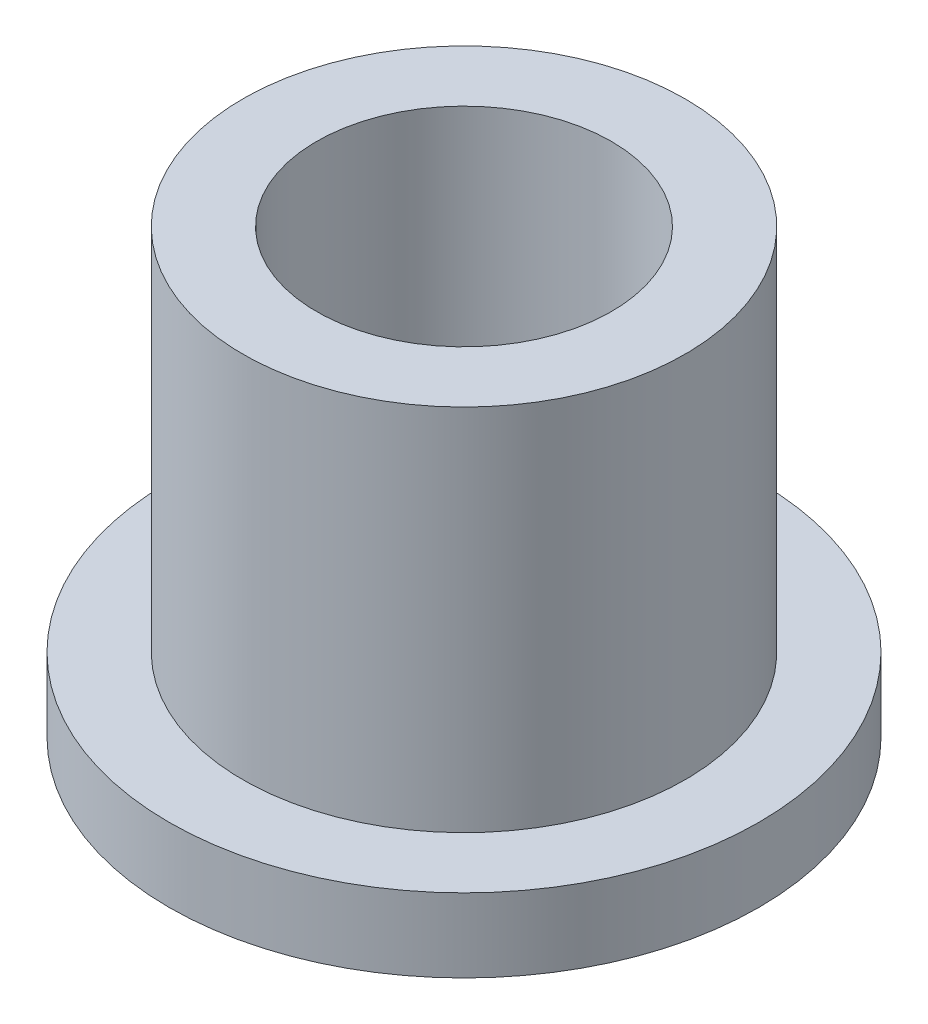
ISO-10303-21;
HEADER;
FILE_DESCRIPTION(('STEP AP214'),'2;1');
FILE_NAME('part.step','',(''),(''),'','','');
FILE_SCHEMA(('AUTOMOTIVE_DESIGN { 1 0 10303 214 1 1 1 1 }'));
ENDSEC;
DATA;
#1=APPLICATION_CONTEXT('core data for automotive mechanical design processes');
#2=APPLICATION_PROTOCOL_DEFINITION('international standard','automotive_design',2000,#1);
#3=PRODUCT_CONTEXT('',#1,'mechanical');
#4=PRODUCT('Part','Part','',(#3));
#5=PRODUCT_RELATED_PRODUCT_CATEGORY('part','',(#4));
#6=PRODUCT_DEFINITION_FORMATION('','',#4);
#7=PRODUCT_DEFINITION_CONTEXT('part definition',#1,'design');
#8=PRODUCT_DEFINITION('design','',#6,#7);
#9=PRODUCT_DEFINITION_SHAPE('','',#8);
#10=(LENGTH_UNIT() NAMED_UNIT(*) SI_UNIT(.MILLI.,.METRE.));
#11=(NAMED_UNIT(*) PLANE_ANGLE_UNIT() SI_UNIT($,.RADIAN.));
#12=(NAMED_UNIT(*) SI_UNIT($,.STERADIAN.) SOLID_ANGLE_UNIT());
#13=UNCERTAINTY_MEASURE_WITH_UNIT(LENGTH_MEASURE(1.E-05),#10,'distance_accuracy_value','');
#14=(GEOMETRIC_REPRESENTATION_CONTEXT(3) GLOBAL_UNCERTAINTY_ASSIGNED_CONTEXT((#13)) GLOBAL_UNIT_ASSIGNED_CONTEXT((#10,
#11,#12)) REPRESENTATION_CONTEXT('',''));
#15=CARTESIAN_POINT('',(0.,0.,0.));
#16=DIRECTION('',(0.,0.,1.));
#17=DIRECTION('',(1.,0.,0.));
#18=AXIS2_PLACEMENT_3D('',#15,#16,#17);
#19=CARTESIAN_POINT('',(0.,9.525,0.));
#20=DIRECTION('',(0.,1.,0.));
#21=DIRECTION('',(0.,0.,1.));
#22=AXIS2_PLACEMENT_3D('',#19,#20,#21);
#23=PLANE('',#22);
#24=CARTESIAN_POINT('',(0.,9.525,0.));
#25=DIRECTION('',(0.,1.,0.));
#26=DIRECTION('',(0.,0.,1.));
#27=AXIS2_PLACEMENT_3D('',#24,#25,#26);
#28=CIRCLE('',#27,4.7625);
#29=CARTESIAN_POINT('',(0.,9.525,-4.7625));
#30=VERTEX_POINT('',#29);
#31=EDGE_CURVE('E10',#30,#30,#28,.T.);
#32=ORIENTED_EDGE('',*,*,#31,.T.);
#33=EDGE_LOOP('',(#32));
#34=FACE_BOUND('',#33,.T.);
#35=CARTESIAN_POINT('',(0.,9.525,0.));
#36=DIRECTION('',(0.,1.,0.));
#37=DIRECTION('',(0.,0.,1.));
#38=AXIS2_PLACEMENT_3D('',#35,#36,#37);
#39=CIRCLE('',#38,3.175);
#40=CARTESIAN_POINT('',(0.,9.525,-3.175));
#41=VERTEX_POINT('',#40);
#42=EDGE_CURVE('E42',#41,#41,#39,.T.);
#43=ORIENTED_EDGE('',*,*,#42,.F.);
#44=EDGE_LOOP('',(#43));
#45=FACE_BOUND('',#44,.T.);
#46=ADVANCED_FACE('F35',(#34,#45),#23,.T.);
#47=CARTESIAN_POINT('',(0.,0.,0.));
#48=DIRECTION('',(0.,1.,0.));
#49=DIRECTION('',(0.,0.,1.));
#50=AXIS2_PLACEMENT_3D('',#47,#48,#49);
#51=PLANE('',#50);
#52=CARTESIAN_POINT('',(0.,0.,0.));
#53=DIRECTION('',(0.,1.,0.));
#54=DIRECTION('',(0.,0.,1.));
#55=AXIS2_PLACEMENT_3D('',#52,#53,#54);
#56=CIRCLE('',#55,3.175);
#57=CARTESIAN_POINT('',(0.,0.,-3.175));
#58=VERTEX_POINT('',#57);
#59=EDGE_CURVE('E46',#58,#58,#56,.T.);
#60=ORIENTED_EDGE('',*,*,#59,.T.);
#61=EDGE_LOOP('',(#60));
#62=FACE_BOUND('',#61,.T.);
#63=CARTESIAN_POINT('',(0.,0.,0.));
#64=DIRECTION('',(0.,1.,0.));
#65=DIRECTION('',(0.,0.,1.));
#66=AXIS2_PLACEMENT_3D('',#63,#64,#65);
#67=CIRCLE('',#66,6.35);
#68=CARTESIAN_POINT('',(0.,0.,6.35));
#69=VERTEX_POINT('',#68);
#70=EDGE_CURVE('E53',#69,#69,#67,.T.);
#71=ORIENTED_EDGE('',*,*,#70,.F.);
#72=EDGE_LOOP('',(#71));
#73=FACE_BOUND('',#72,.T.);
#74=ADVANCED_FACE('F78',(#62,#73),#51,.F.);
#75=CARTESIAN_POINT('',(0.,9.525,0.));
#76=DIRECTION('',(0.,-1.,0.));
#77=DIRECTION('',(0.,0.,-1.));
#78=AXIS2_PLACEMENT_3D('',#75,#76,#77);
#79=CYLINDRICAL_SURFACE('',#78,4.7625);
#80=CARTESIAN_POINT('',(0.,1.5875,0.));
#81=DIRECTION('',(0.,1.,0.));
#82=DIRECTION('',(0.,0.,1.));
#83=AXIS2_PLACEMENT_3D('',#80,#81,#82);
#84=CIRCLE('',#83,4.7625);
#85=CARTESIAN_POINT('',(0.,1.5875,-4.7625));
#86=VERTEX_POINT('',#85);
#87=EDGE_CURVE('E56',#86,#86,#84,.T.);
#88=CARTESIAN_POINT('',(0.,1.5875,-4.7625));
#89=CARTESIAN_POINT('',(0.,1.67018229166667,-4.7625));
#90=CARTESIAN_POINT('',(0.,1.75286458333333,-4.7625));
#91=CARTESIAN_POINT('',(0.,1.91822916666666,-4.7625));
#92=CARTESIAN_POINT('',(0.,2.00091145833333,-4.7625));
#93=CARTESIAN_POINT('',(0.,2.16627604166666,-4.7625));
#94=CARTESIAN_POINT('',(0.,2.24895833333333,-4.7625));
#95=CARTESIAN_POINT('',(0.,2.41432291666667,-4.7625));
#96=CARTESIAN_POINT('',(0.,2.49700520833333,-4.7625));
#97=CARTESIAN_POINT('',(0.,2.66236979166666,-4.7625));
#98=CARTESIAN_POINT('',(0.,2.74505208333333,-4.7625));
#99=CARTESIAN_POINT('',(0.,2.91041666666667,-4.7625));
#100=CARTESIAN_POINT('',(0.,2.99309895833333,-4.7625));
#101=CARTESIAN_POINT('',(0.,3.15846354166667,-4.7625));
#102=CARTESIAN_POINT('',(0.,3.24114583333333,-4.7625));
#103=CARTESIAN_POINT('',(0.,3.40651041666667,-4.7625));
#104=CARTESIAN_POINT('',(0.,3.48919270833333,-4.7625));
#105=CARTESIAN_POINT('',(0.,3.65455729166667,-4.7625));
#106=CARTESIAN_POINT('',(0.,3.73723958333333,-4.7625));
#107=CARTESIAN_POINT('',(0.,3.90260416666667,-4.7625));
#108=CARTESIAN_POINT('',(0.,3.98528645833333,-4.7625));
#109=CARTESIAN_POINT('',(0.,4.15065104166667,-4.7625));
#110=CARTESIAN_POINT('',(0.,4.23333333333333,-4.7625));
#111=CARTESIAN_POINT('',(0.,4.39869791666667,-4.7625));
#112=CARTESIAN_POINT('',(0.,4.48138020833333,-4.7625));
#113=CARTESIAN_POINT('',(0.,4.64674479166667,-4.7625));
#114=CARTESIAN_POINT('',(0.,4.72942708333333,-4.7625));
#115=CARTESIAN_POINT('',(0.,4.89479166666667,-4.7625));
#116=CARTESIAN_POINT('',(0.,4.97747395833333,-4.7625));
#117=CARTESIAN_POINT('',(0.,5.14283854166667,-4.7625));
#118=CARTESIAN_POINT('',(0.,5.22552083333333,-4.7625));
#119=CARTESIAN_POINT('',(0.,5.39088541666667,-4.7625));
#120=CARTESIAN_POINT('',(0.,5.47356770833333,-4.7625));
#121=CARTESIAN_POINT('',(0.,5.63893229166667,-4.7625));
#122=CARTESIAN_POINT('',(0.,5.72161458333333,-4.7625));
#123=CARTESIAN_POINT('',(0.,5.88697916666667,-4.7625));
#124=CARTESIAN_POINT('',(0.,5.96966145833333,-4.7625));
#125=CARTESIAN_POINT('',(0.,6.13502604166667,-4.7625));
#126=CARTESIAN_POINT('',(0.,6.21770833333333,-4.7625));
#127=CARTESIAN_POINT('',(0.,6.38307291666667,-4.7625));
#128=CARTESIAN_POINT('',(0.,6.46575520833333,-4.7625));
#129=CARTESIAN_POINT('',(0.,6.63111979166667,-4.7625));
#130=CARTESIAN_POINT('',(0.,6.71380208333333,-4.7625));
#131=CARTESIAN_POINT('',(0.,6.87916666666667,-4.7625));
#132=CARTESIAN_POINT('',(0.,6.96184895833333,-4.7625));
#133=CARTESIAN_POINT('',(0.,7.12721354166667,-4.7625));
#134=CARTESIAN_POINT('',(0.,7.20989583333333,-4.7625));
#135=CARTESIAN_POINT('',(0.,7.37526041666667,-4.7625));
#136=CARTESIAN_POINT('',(0.,7.45794270833333,-4.7625));
#137=CARTESIAN_POINT('',(0.,7.62330729166667,-4.7625));
#138=CARTESIAN_POINT('',(0.,7.70598958333333,-4.7625));
#139=CARTESIAN_POINT('',(0.,7.87135416666667,-4.7625));
#140=CARTESIAN_POINT('',(0.,7.95403645833333,-4.7625));
#141=CARTESIAN_POINT('',(0.,8.11940104166667,-4.7625));
#142=CARTESIAN_POINT('',(0.,8.20208333333333,-4.7625));
#143=CARTESIAN_POINT('',(0.,8.36744791666667,-4.7625));
#144=CARTESIAN_POINT('',(0.,8.45013020833333,-4.7625));
#145=CARTESIAN_POINT('',(0.,8.61549479166667,-4.7625));
#146=CARTESIAN_POINT('',(0.,8.69817708333333,-4.7625));
#147=CARTESIAN_POINT('',(0.,8.86354166666667,-4.7625));
#148=CARTESIAN_POINT('',(0.,8.94622395833333,-4.7625));
#149=CARTESIAN_POINT('',(0.,9.11158854166667,-4.7625));
#150=CARTESIAN_POINT('',(0.,9.19427083333333,-4.7625));
#151=CARTESIAN_POINT('',(0.,9.35963541666667,-4.7625));
#152=CARTESIAN_POINT('',(0.,9.44231770833333,-4.7625));
#153=CARTESIAN_POINT('',(0.,9.525,-4.7625));
#154=B_SPLINE_CURVE_WITH_KNOTS('',3,(#88,#89,#90,#91,#92,#93,#94,#95,#96,#97,#98,#99,#100,#101,
#102,#103,#104,#105,#106,#107,#108,#109,#110,#111,#112,#113,#114,#115,#116,#117,#118,#119,#120,
#121,#122,#123,#124,#125,#126,#127,#128,#129,#130,#131,#132,#133,#134,#135,#136,#137,#138,#139,
#140,#141,#142,#143,#144,#145,#146,#147,#148,#149,#150,#151,#152,#153),.UNSPECIFIED.,.F.,.F.,(4,
2,2,2,2,2,2,2,2,2,2,2,2,2,2,2,2,2,2,2,2,2,2,2,2,2,2,2,2,2,2,2,4),(0.,0.248046875,
0.496093749999999,0.744140625,0.992187499999999,1.240234375,1.48828125,1.736328125,1.984375,
2.232421875,2.48046875,2.728515625,2.9765625,3.224609375,3.47265625,3.720703125,3.96875,
4.216796875,4.46484375,4.712890625,4.9609375,5.208984375,5.45703125,5.705078125,5.953125,
6.201171875,6.44921875,6.697265625,6.9453125,7.193359375,7.44140625,7.689453125,7.9375),.UNSPECIFIED.);
#155=EDGE_CURVE('BSEAM37',#86,#30,#154,.T.);
#156=ORIENTED_EDGE('',*,*,#87,.T.);
#157=ORIENTED_EDGE('',*,*,#31,.F.);
#158=ORIENTED_EDGE('',*,*,#155,.T.);
#159=ORIENTED_EDGE('',*,*,#155,.F.);
#160=EDGE_LOOP('',(#156,#158,#157,#159));
#161=FACE_BOUND('',#160,.T.);
#162=ADVANCED_FACE('F37',(#161),#79,.T.);
#163=CARTESIAN_POINT('',(0.,9.525,0.));
#164=DIRECTION('',(0.,-1.,0.));
#165=DIRECTION('',(0.,0.,-1.));
#166=AXIS2_PLACEMENT_3D('',#163,#164,#165);
#167=CYLINDRICAL_SURFACE('',#166,3.175);
#168=CARTESIAN_POINT('',(0.,9.525,-3.175));
#169=CARTESIAN_POINT('',(0.,9.42578125,-3.175));
#170=CARTESIAN_POINT('',(0.,9.3265625,-3.175));
#171=CARTESIAN_POINT('',(0.,9.128125,-3.175));
#172=CARTESIAN_POINT('',(0.,9.02890625,-3.175));
#173=CARTESIAN_POINT('',(0.,8.83046875,-3.175));
#174=CARTESIAN_POINT('',(0.,8.73125,-3.175));
#175=CARTESIAN_POINT('',(0.,8.5328125,-3.175));
#176=CARTESIAN_POINT('',(0.,8.43359375,-3.175));
#177=CARTESIAN_POINT('',(0.,8.23515625,-3.175));
#178=CARTESIAN_POINT('',(0.,8.1359375,-3.175));
#179=CARTESIAN_POINT('',(0.,7.9375,-3.175));
#180=CARTESIAN_POINT('',(0.,7.83828125,-3.175));
#181=CARTESIAN_POINT('',(0.,7.63984375,-3.175));
#182=CARTESIAN_POINT('',(0.,7.540625,-3.175));
#183=CARTESIAN_POINT('',(0.,7.3421875,-3.175));
#184=CARTESIAN_POINT('',(0.,7.24296875,-3.175));
#185=CARTESIAN_POINT('',(0.,7.04453125,-3.175));
#186=CARTESIAN_POINT('',(0.,6.9453125,-3.175));
#187=CARTESIAN_POINT('',(0.,6.746875,-3.175));
#188=CARTESIAN_POINT('',(0.,6.64765625,-3.175));
#189=CARTESIAN_POINT('',(0.,6.44921875,-3.175));
#190=CARTESIAN_POINT('',(0.,6.35,-3.175));
#191=CARTESIAN_POINT('',(0.,6.1515625,-3.175));
#192=CARTESIAN_POINT('',(0.,6.05234375,-3.175));
#193=CARTESIAN_POINT('',(0.,5.85390625,-3.175));
#194=CARTESIAN_POINT('',(0.,5.7546875,-3.175));
#195=CARTESIAN_POINT('',(0.,5.55625,-3.175));
#196=CARTESIAN_POINT('',(0.,5.45703125,-3.175));
#197=CARTESIAN_POINT('',(0.,5.25859375,-3.175));
#198=CARTESIAN_POINT('',(0.,5.159375,-3.175));
#199=CARTESIAN_POINT('',(0.,4.9609375,-3.175));
#200=CARTESIAN_POINT('',(0.,4.86171875,-3.175));
#201=CARTESIAN_POINT('',(0.,4.66328125,-3.175));
#202=CARTESIAN_POINT('',(0.,4.5640625,-3.175));
#203=CARTESIAN_POINT('',(0.,4.365625,-3.175));
#204=CARTESIAN_POINT('',(0.,4.26640625,-3.175));
#205=CARTESIAN_POINT('',(0.,4.06796875,-3.175));
#206=CARTESIAN_POINT('',(0.,3.96875,-3.175));
#207=CARTESIAN_POINT('',(0.,3.7703125,-3.175));
#208=CARTESIAN_POINT('',(0.,3.67109375,-3.175));
#209=CARTESIAN_POINT('',(0.,3.47265625,-3.175));
#210=CARTESIAN_POINT('',(0.,3.3734375,-3.175));
#211=CARTESIAN_POINT('',(0.,3.175,-3.175));
#212=CARTESIAN_POINT('',(0.,3.07578125,-3.175));
#213=CARTESIAN_POINT('',(0.,2.87734375,-3.175));
#214=CARTESIAN_POINT('',(0.,2.778125,-3.175));
#215=CARTESIAN_POINT('',(0.,2.5796875,-3.175));
#216=CARTESIAN_POINT('',(0.,2.48046875,-3.175));
#217=CARTESIAN_POINT('',(0.,2.28203125,-3.175));
#218=CARTESIAN_POINT('',(0.,2.1828125,-3.175));
#219=CARTESIAN_POINT('',(0.,1.984375,-3.175));
#220=CARTESIAN_POINT('',(0.,1.88515625,-3.175));
#221=CARTESIAN_POINT('',(0.,1.68671875,-3.175));
#222=CARTESIAN_POINT('',(0.,1.5875,-3.175));
#223=CARTESIAN_POINT('',(0.,1.3890625,-3.175));
#224=CARTESIAN_POINT('',(0.,1.28984375,-3.175));
#225=CARTESIAN_POINT('',(0.,1.09140625,-3.175));
#226=CARTESIAN_POINT('',(0.,0.992187500000001,-3.175));
#227=CARTESIAN_POINT('',(0.,0.793750000000001,-3.175));
#228=CARTESIAN_POINT('',(0.,0.69453125,-3.175));
#229=CARTESIAN_POINT('',(0.,0.49609375,-3.175));
#230=CARTESIAN_POINT('',(0.,0.396875,-3.175));
#231=CARTESIAN_POINT('',(0.,0.1984375,-3.175));
#232=CARTESIAN_POINT('',(0.,0.0992187500000001,-3.175));
#233=CARTESIAN_POINT('',(0.,0.,-3.175));
#234=B_SPLINE_CURVE_WITH_KNOTS('',3,(#168,#169,#170,#171,#172,#173,#174,#175,#176,#177,#178,
#179,#180,#181,#182,#183,#184,#185,#186,#187,#188,#189,#190,#191,#192,#193,#194,#195,#196,#197,
#198,#199,#200,#201,#202,#203,#204,#205,#206,#207,#208,#209,#210,#211,#212,#213,#214,#215,#216,
#217,#218,#219,#220,#221,#222,#223,#224,#225,#226,#227,#228,#229,#230,#231,#232,#233),
.UNSPECIFIED.,.F.,.F.,(4,2,2,2,2,2,2,2,2,2,2,2,2,2,2,2,2,2,2,2,2,2,2,2,2,2,2,2,2,2,2,2,4),(0.,
0.29765625,0.5953125,0.892968750000001,1.190625,1.48828125,1.7859375,2.08359375,2.38125,
2.67890625,2.9765625,3.27421875,3.571875,3.86953125,4.1671875,4.46484375,4.7625,5.06015625,
5.3578125,5.65546875,5.953125,6.25078125,6.5484375,6.84609375,7.14375,7.44140625,7.7390625,
8.03671875,8.334375,8.63203125,8.9296875,9.22734375,9.525),.UNSPECIFIED.);
#235=EDGE_CURVE('BSEAM67',#41,#58,#234,.T.);
#236=ORIENTED_EDGE('',*,*,#42,.T.);
#237=ORIENTED_EDGE('',*,*,#59,.F.);
#238=ORIENTED_EDGE('',*,*,#235,.T.);
#239=ORIENTED_EDGE('',*,*,#235,.F.);
#240=EDGE_LOOP('',(#236,#238,#237,#239));
#241=FACE_BOUND('',#240,.T.);
#242=ADVANCED_FACE('F67',(#241),#167,.F.);
#243=CARTESIAN_POINT('',(0.,1.5875,0.));
#244=DIRECTION('',(0.,1.,0.));
#245=DIRECTION('',(0.,0.,1.));
#246=AXIS2_PLACEMENT_3D('',#243,#244,#245);
#247=PLANE('',#246);
#248=CARTESIAN_POINT('',(0.,1.5875,0.));
#249=DIRECTION('',(0.,1.,0.));
#250=DIRECTION('',(0.,0.,1.));
#251=AXIS2_PLACEMENT_3D('',#248,#249,#250);
#252=CIRCLE('',#251,6.35);
#253=CARTESIAN_POINT('',(0.,1.5875,6.35));
#254=VERTEX_POINT('',#253);
#255=EDGE_CURVE('E51',#254,#254,#252,.T.);
#256=ORIENTED_EDGE('',*,*,#255,.T.);
#257=EDGE_LOOP('',(#256));
#258=FACE_BOUND('',#257,.T.);
#259=ORIENTED_EDGE('',*,*,#87,.F.);
#260=EDGE_LOOP('',(#259));
#261=FACE_BOUND('',#260,.T.);
#262=ADVANCED_FACE('F64',(#258,#261),#247,.T.);
#263=CARTESIAN_POINT('',(0.,1.5875,0.));
#264=DIRECTION('',(0.,-1.,0.));
#265=DIRECTION('',(0.,0.,-1.));
#266=AXIS2_PLACEMENT_3D('',#263,#264,#265);
#267=CYLINDRICAL_SURFACE('',#266,6.35);
#268=ORIENTED_EDGE('',*,*,#255,.F.);
#269=EDGE_LOOP('',(#268));
#270=FACE_BOUND('',#269,.T.);
#271=ORIENTED_EDGE('',*,*,#70,.T.);
#272=EDGE_LOOP('',(#271));
#273=FACE_BOUND('',#272,.T.);
#274=ADVANCED_FACE('F66',(#270,#273),#267,.T.);
#275=CLOSED_SHELL('',(#46,#74,#162,#242,#262,#274));
#276=MANIFOLD_SOLID_BREP('B2',#275);
#277=ADVANCED_BREP_SHAPE_REPRESENTATION('',(#18,#276),#14);
#278=SHAPE_DEFINITION_REPRESENTATION(#9,#277);
ENDSEC;
END-ISO-10303-21;
